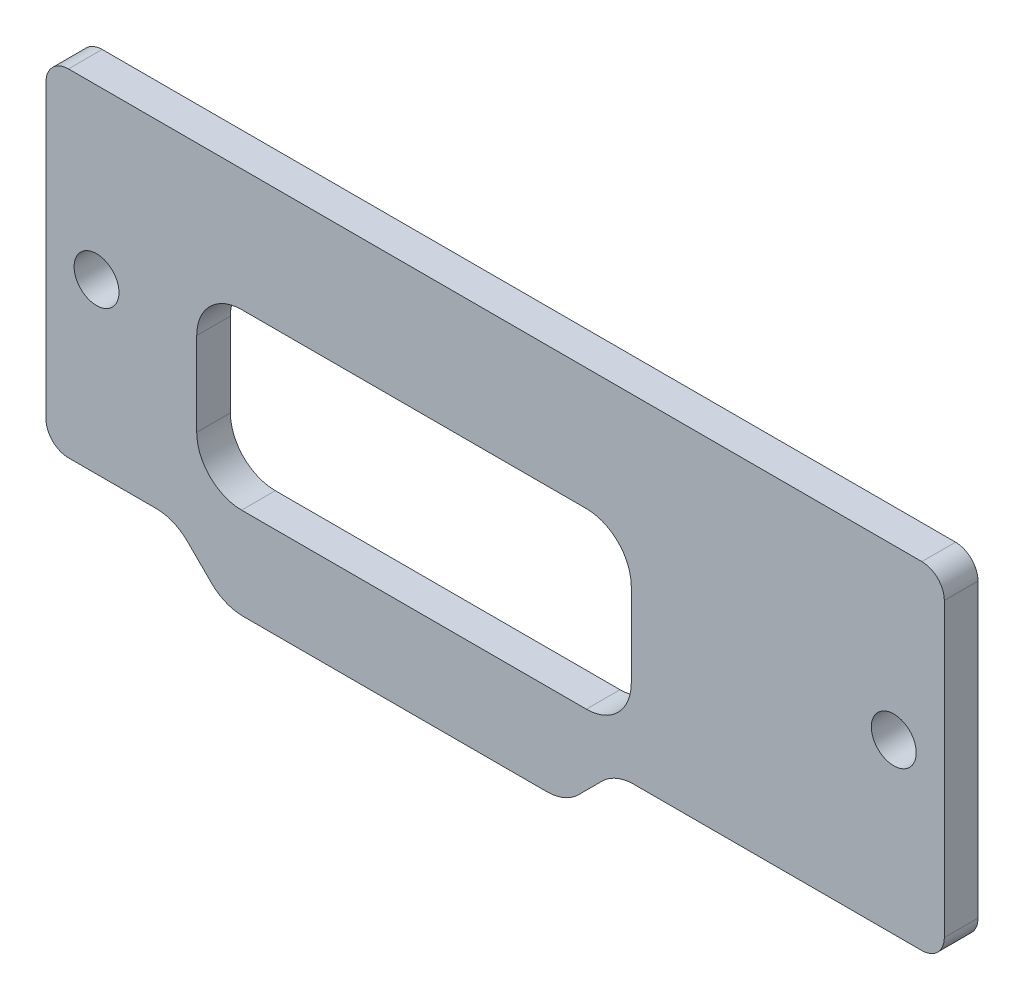
ISO-10303-21;
HEADER;
FILE_DESCRIPTION(('STEP AP214'),'2;1');
FILE_NAME('part.step','',(''),(''),'','','');
FILE_SCHEMA(('AUTOMOTIVE_DESIGN { 1 0 10303 214 1 1 1 1 }'));
ENDSEC;
DATA;
#1=APPLICATION_CONTEXT('core data for automotive mechanical design processes');
#2=APPLICATION_PROTOCOL_DEFINITION('international standard','automotive_design',2000,#1);
#3=PRODUCT_CONTEXT('',#1,'mechanical');
#4=PRODUCT('Part','Part','',(#3));
#5=PRODUCT_RELATED_PRODUCT_CATEGORY('part','',(#4));
#6=PRODUCT_DEFINITION_FORMATION('','',#4);
#7=PRODUCT_DEFINITION_CONTEXT('part definition',#1,'design');
#8=PRODUCT_DEFINITION('design','',#6,#7);
#9=PRODUCT_DEFINITION_SHAPE('','',#8);
#10=(LENGTH_UNIT() NAMED_UNIT(*) SI_UNIT(.MILLI.,.METRE.));
#11=(NAMED_UNIT(*) PLANE_ANGLE_UNIT() SI_UNIT($,.RADIAN.));
#12=(NAMED_UNIT(*) SI_UNIT($,.STERADIAN.) SOLID_ANGLE_UNIT());
#13=UNCERTAINTY_MEASURE_WITH_UNIT(LENGTH_MEASURE(1.E-05),#10,'distance_accuracy_value','');
#14=(GEOMETRIC_REPRESENTATION_CONTEXT(3) GLOBAL_UNCERTAINTY_ASSIGNED_CONTEXT((#13)) GLOBAL_UNIT_ASSIGNED_CONTEXT((#10,
#11,#12)) REPRESENTATION_CONTEXT('',''));
#15=CARTESIAN_POINT('',(0.,0.,0.));
#16=DIRECTION('',(0.,0.,1.));
#17=DIRECTION('',(1.,0.,0.));
#18=AXIS2_PLACEMENT_3D('',#15,#16,#17);
#19=CARTESIAN_POINT('',(-23.9884406525876,-3.16320030945431,1.5));
#20=DIRECTION('',(0.,1.,0.));
#21=DIRECTION('',(-1.,0.,0.));
#22=AXIS2_PLACEMENT_3D('',#19,#20,#21);
#23=PLANE('',#22);
#24=DIRECTION('',(1.,0.,0.));
#25=VECTOR('',#24,1.);
#26=CARTESIAN_POINT('',(-23.9884406525876,-3.16320030945431,1.5));
#27=LINE('',#26,#25);
#28=CARTESIAN_POINT('',(2.18763376843959,-3.1632003094543,1.5));
#29=VERTEX_POINT('',#28);
#30=CARTESIAN_POINT('',(15.0115593474124,-3.1632003094543,1.5));
#31=VERTEX_POINT('',#30);
#32=EDGE_CURVE('E361',#29,#31,#27,.T.);
#33=ORIENTED_EDGE('',*,*,#32,.F.);
#34=DIRECTION('',(0.,0.,-1.));
#35=VECTOR('',#34,1.);
#36=CARTESIAN_POINT('',(2.18763376843959,-3.1632003094543,1.5));
#37=LINE('',#36,#35);
#38=CARTESIAN_POINT('',(2.18763376843959,-3.1632003094543,0.));
#39=VERTEX_POINT('',#38);
#40=EDGE_CURVE('E302',#29,#39,#37,.T.);
#41=ORIENTED_EDGE('',*,*,#40,.T.);
#42=DIRECTION('',(1.,0.,0.));
#43=VECTOR('',#42,1.);
#44=CARTESIAN_POINT('',(-23.9884406525876,-3.16320030945431,0.));
#45=LINE('',#44,#43);
#46=CARTESIAN_POINT('',(15.0115593474124,-3.1632003094543,0.));
#47=VERTEX_POINT('',#46);
#48=EDGE_CURVE('E228',#39,#47,#45,.T.);
#49=ORIENTED_EDGE('',*,*,#48,.T.);
#50=DIRECTION('',(0.,0.,-1.));
#51=VECTOR('',#50,1.);
#52=CARTESIAN_POINT('',(15.0115593474124,-3.1632003094543,1.5));
#53=LINE('',#52,#51);
#54=EDGE_CURVE('E258',#47,#31,#53,.F.);
#55=ORIENTED_EDGE('',*,*,#54,.T.);
#56=EDGE_LOOP('',(#33,#41,#49,#55));
#57=FACE_BOUND('',#56,.T.);
#58=ADVANCED_FACE('F35',(#57),#23,.F.);
#59=CARTESIAN_POINT('',(0.,0.,1.5));
#60=DIRECTION('',(0.,0.,1.));
#61=DIRECTION('',(1.,0.,0.));
#62=AXIS2_PLACEMENT_3D('',#59,#60,#61);
#63=PLANE('',#62);
#64=DIRECTION('',(1.,0.,0.));
#65=VECTOR('',#64,1.);
#66=CARTESIAN_POINT('',(-16.0408149730745,-5.38649190676645,1.5));
#67=LINE('',#66,#65);
#68=CARTESIAN_POINT('',(-15.2123878483284,-5.38649190676645,1.5));
#69=VERTEX_POINT('',#68);
#70=CARTESIAN_POINT('',(-1.69251207836489,-5.3864919067664,1.5));
#71=VERTEX_POINT('',#70);
#72=EDGE_CURVE('E344',#69,#71,#67,.T.);
#73=ORIENTED_EDGE('',*,*,#72,.T.);
#74=CARTESIAN_POINT('',(-1.69251207836489,-3.3864919067664,1.5));
#75=DIRECTION('',(0.,0.,1.));
#76=DIRECTION('',(1.,0.,0.));
#77=AXIS2_PLACEMENT_3D('',#74,#75,#76);
#78=CIRCLE('',#77,2.);
#79=CARTESIAN_POINT('',(-0.278298515991804,-4.8007054691395,1.5));
#80=VERTEX_POINT('',#79);
#81=EDGE_CURVE('E316',#71,#80,#78,.T.);
#82=ORIENTED_EDGE('',*,*,#81,.T.);
#83=DIRECTION('',(0.707106781186549,0.707106781186546,0.));
#84=VECTOR('',#83,1.);
#85=CARTESIAN_POINT('',(-0.864084953618706,-5.3864919067664,1.5));
#86=LINE('',#85,#84);
#87=CARTESIAN_POINT('',(0.773420206066497,-3.74898674708121,1.5));
#88=VERTEX_POINT('',#87);
#89=EDGE_CURVE('E405',#80,#88,#86,.T.);
#90=ORIENTED_EDGE('',*,*,#89,.T.);
#91=CARTESIAN_POINT('',(2.18763376843959,-5.1632003094543,1.5));
#92=DIRECTION('',(0.,0.,1.));
#93=DIRECTION('',(1.,0.,0.));
#94=AXIS2_PLACEMENT_3D('',#91,#92,#93);
#95=CIRCLE('',#94,2.);
#96=EDGE_CURVE('E331',#88,#29,#95,.F.);
#97=ORIENTED_EDGE('',*,*,#96,.T.);
#98=ORIENTED_EDGE('',*,*,#32,.T.);
#99=CARTESIAN_POINT('',(15.0115593474124,-2.1632003094543,1.5));
#100=DIRECTION('',(0.,0.,1.));
#101=DIRECTION('',(1.,0.,0.));
#102=AXIS2_PLACEMENT_3D('',#99,#100,#101);
#103=CIRCLE('',#102,1.);
#104=CARTESIAN_POINT('',(16.0115593474124,-2.1632003094543,1.5));
#105=VERTEX_POINT('',#104);
#106=EDGE_CURVE('E251',#31,#105,#103,.T.);
#107=ORIENTED_EDGE('',*,*,#106,.T.);
#108=DIRECTION('',(0.,1.,0.));
#109=VECTOR('',#108,1.);
#110=CARTESIAN_POINT('',(16.0115593474124,11.8367996905457,1.5));
#111=LINE('',#110,#109);
#112=CARTESIAN_POINT('',(16.0115593474124,10.8367996905457,1.5));
#113=VERTEX_POINT('',#112);
#114=EDGE_CURVE('E236',#105,#113,#111,.T.);
#115=ORIENTED_EDGE('',*,*,#114,.T.);
#116=CARTESIAN_POINT('',(15.0115593474124,10.8367996905457,1.5));
#117=DIRECTION('',(0.,0.,1.));
#118=DIRECTION('',(1.,0.,0.));
#119=AXIS2_PLACEMENT_3D('',#116,#117,#118);
#120=CIRCLE('',#119,1.);
#121=CARTESIAN_POINT('',(15.0115593474124,11.8367996905457,1.5));
#122=VERTEX_POINT('',#121);
#123=EDGE_CURVE('E253',#113,#122,#120,.T.);
#124=ORIENTED_EDGE('',*,*,#123,.T.);
#125=DIRECTION('',(-1.,0.,0.));
#126=VECTOR('',#125,1.);
#127=CARTESIAN_POINT('',(-23.9884406525876,11.8367996905457,1.5));
#128=LINE('',#127,#126);
#129=CARTESIAN_POINT('',(-22.9884406525876,11.8367996905457,1.5));
#130=VERTEX_POINT('',#129);
#131=EDGE_CURVE('E216',#122,#130,#128,.T.);
#132=ORIENTED_EDGE('',*,*,#131,.T.);
#133=CARTESIAN_POINT('',(-22.9884406525876,10.8367996905457,1.5));
#134=DIRECTION('',(0.,0.,1.));
#135=DIRECTION('',(1.,0.,0.));
#136=AXIS2_PLACEMENT_3D('',#133,#134,#135);
#137=CIRCLE('',#136,1.);
#138=CARTESIAN_POINT('',(-23.9884406525876,10.8367996905457,1.5));
#139=VERTEX_POINT('',#138);
#140=EDGE_CURVE('E247',#130,#139,#137,.T.);
#141=ORIENTED_EDGE('',*,*,#140,.T.);
#142=DIRECTION('',(0.,-1.,0.));
#143=VECTOR('',#142,1.);
#144=CARTESIAN_POINT('',(-23.9884406525876,11.8367996905457,1.5));
#145=LINE('',#144,#143);
#146=CARTESIAN_POINT('',(-23.9884406525876,-2.16320030945431,1.5));
#147=VERTEX_POINT('',#146);
#148=EDGE_CURVE('E359',#139,#147,#145,.T.);
#149=ORIENTED_EDGE('',*,*,#148,.T.);
#150=CARTESIAN_POINT('',(-22.9884406525876,-2.16320030945431,1.5));
#151=DIRECTION('',(0.,0.,1.));
#152=DIRECTION('',(1.,0.,0.));
#153=AXIS2_PLACEMENT_3D('',#150,#151,#152);
#154=CIRCLE('',#153,1.);
#155=CARTESIAN_POINT('',(-22.9884406525876,-3.16320030945431,1.5));
#156=VERTEX_POINT('',#155);
#157=EDGE_CURVE('E249',#147,#156,#154,.T.);
#158=ORIENTED_EDGE('',*,*,#157,.T.);
#159=CARTESIAN_POINT('',(-19.0925336951329,-3.16320030945431,1.5));
#160=VERTEX_POINT('',#159);
#161=EDGE_CURVE('E237',#156,#160,#27,.T.);
#162=ORIENTED_EDGE('',*,*,#161,.T.);
#163=CARTESIAN_POINT('',(-19.0925336951329,-5.16320030945431,1.5));
#164=DIRECTION('',(0.,0.,1.));
#165=DIRECTION('',(1.,0.,0.));
#166=AXIS2_PLACEMENT_3D('',#163,#164,#165);
#167=CIRCLE('',#166,2.);
#168=CARTESIAN_POINT('',(-17.6783201327598,-3.74898674708119,1.5));
#169=VERTEX_POINT('',#168);
#170=EDGE_CURVE('E43',#160,#169,#167,.F.);
#171=ORIENTED_EDGE('',*,*,#170,.T.);
#172=DIRECTION('',(0.707106781186556,-0.707106781186539,0.));
#173=VECTOR('',#172,1.);
#174=CARTESIAN_POINT('',(-18.8396405091301,-2.587666370711,1.5));
#175=LINE('',#174,#173);
#176=CARTESIAN_POINT('',(-16.6266014107015,-4.80070546913956,1.5));
#177=VERTEX_POINT('',#176);
#178=EDGE_CURVE('E338',#169,#177,#175,.T.);
#179=ORIENTED_EDGE('',*,*,#178,.T.);
#180=CARTESIAN_POINT('',(-15.2123878483284,-3.38649190676645,1.5));
#181=DIRECTION('',(0.,0.,1.));
#182=DIRECTION('',(1.,0.,0.));
#183=AXIS2_PLACEMENT_3D('',#180,#181,#182);
#184=CIRCLE('',#183,2.);
#185=EDGE_CURVE('E314',#177,#69,#184,.T.);
#186=ORIENTED_EDGE('',*,*,#185,.T.);
#187=EDGE_LOOP('',(#73,#82,#90,#97,#98,#107,#115,#124,#132,#141,#149,#158,#162,#171,#179,#186));
#188=FACE_BOUND('',#187,.T.);
#189=DIRECTION('',(0.,1.,0.));
#190=VECTOR('',#189,1.);
#191=CARTESIAN_POINT('',(2.07197520372589,6.40966960987009,1.5));
#192=LINE('',#191,#190);
#193=CARTESIAN_POINT('',(2.07197520372589,0.676475828944844,1.5));
#194=VERTEX_POINT('',#193);
#195=CARTESIAN_POINT('',(2.07197520372589,4.40966960987009,1.5));
#196=VERTEX_POINT('',#195);
#197=EDGE_CURVE('E389',#194,#196,#192,.T.);
#198=ORIENTED_EDGE('',*,*,#197,.F.);
#199=CARTESIAN_POINT('',(0.071975203725887,0.676475828944844,1.5));
#200=DIRECTION('',(0.,0.,1.));
#201=DIRECTION('',(1.,0.,0.));
#202=AXIS2_PLACEMENT_3D('',#199,#200,#201);
#203=CIRCLE('',#202,2.);
#204=CARTESIAN_POINT('',(0.0719752037258853,-1.32352417105516,1.5));
#205=VERTEX_POINT('',#204);
#206=EDGE_CURVE('E290',#194,#205,#203,.F.);
#207=ORIENTED_EDGE('',*,*,#206,.T.);
#208=DIRECTION('',(1.,0.,0.));
#209=VECTOR('',#208,1.);
#210=CARTESIAN_POINT('',(-17.2774271650427,-1.32352417105516,1.5));
#211=LINE('',#210,#209);
#212=CARTESIAN_POINT('',(-15.2774271650427,-1.32352417105516,1.5));
#213=VERTEX_POINT('',#212);
#214=EDGE_CURVE('E379',#213,#205,#211,.T.);
#215=ORIENTED_EDGE('',*,*,#214,.F.);
#216=CARTESIAN_POINT('',(-15.2774271650427,0.676475828944844,1.5));
#217=DIRECTION('',(0.,0.,1.));
#218=DIRECTION('',(1.,0.,0.));
#219=AXIS2_PLACEMENT_3D('',#216,#217,#218);
#220=CIRCLE('',#219,2.);
#221=CARTESIAN_POINT('',(-17.2774271650427,0.676475828944844,1.5));
#222=VERTEX_POINT('',#221);
#223=EDGE_CURVE('E294',#213,#222,#220,.F.);
#224=ORIENTED_EDGE('',*,*,#223,.T.);
#225=DIRECTION('',(0.,-1.,0.));
#226=VECTOR('',#225,1.);
#227=CARTESIAN_POINT('',(-17.2774271650427,6.40966960987009,1.5));
#228=LINE('',#227,#226);
#229=CARTESIAN_POINT('',(-17.2774271650427,4.40966960987009,1.5));
#230=VERTEX_POINT('',#229);
#231=EDGE_CURVE('E383',#230,#222,#228,.T.);
#232=ORIENTED_EDGE('',*,*,#231,.F.);
#233=CARTESIAN_POINT('',(-15.2774271650427,4.40966960987009,1.5));
#234=DIRECTION('',(0.,0.,1.));
#235=DIRECTION('',(1.,0.,0.));
#236=AXIS2_PLACEMENT_3D('',#233,#234,#235);
#237=CIRCLE('',#236,2.);
#238=CARTESIAN_POINT('',(-15.2774271650427,6.40966960987009,1.5));
#239=VERTEX_POINT('',#238);
#240=EDGE_CURVE('E298',#230,#239,#237,.F.);
#241=ORIENTED_EDGE('',*,*,#240,.T.);
#242=DIRECTION('',(-1.,0.,0.));
#243=VECTOR('',#242,1.);
#244=CARTESIAN_POINT('',(-17.2774271650427,6.40966960987009,1.5));
#245=LINE('',#244,#243);
#246=CARTESIAN_POINT('',(0.0719752037258853,6.40966960987009,1.5));
#247=VERTEX_POINT('',#246);
#248=EDGE_CURVE('E386',#247,#239,#245,.T.);
#249=ORIENTED_EDGE('',*,*,#248,.F.);
#250=CARTESIAN_POINT('',(0.0719752037258853,4.40966960987009,1.5));
#251=DIRECTION('',(0.,0.,1.));
#252=DIRECTION('',(1.,0.,0.));
#253=AXIS2_PLACEMENT_3D('',#250,#251,#252);
#254=CIRCLE('',#253,2.);
#255=EDGE_CURVE('E286',#247,#196,#254,.F.);
#256=ORIENTED_EDGE('',*,*,#255,.T.);
#257=EDGE_LOOP('',(#198,#207,#215,#224,#232,#241,#249,#256));
#258=FACE_BOUND('',#257,.T.);
#259=CARTESIAN_POINT('',(-21.7384406525876,4.33679969054569,1.5));
#260=DIRECTION('',(0.,0.,1.));
#261=DIRECTION('',(1.,0.,0.));
#262=AXIS2_PLACEMENT_3D('',#259,#260,#261);
#263=CIRCLE('',#262,1.);
#264=CARTESIAN_POINT('',(-20.7384406525876,4.33679969054569,1.5));
#265=VERTEX_POINT('',#264);
#266=EDGE_CURVE('E230',#265,#265,#263,.T.);
#267=ORIENTED_EDGE('',*,*,#266,.F.);
#268=EDGE_LOOP('',(#267));
#269=FACE_BOUND('',#268,.T.);
#270=CARTESIAN_POINT('',(13.7615593474124,4.3367996905457,1.5));
#271=DIRECTION('',(0.,0.,1.));
#272=DIRECTION('',(1.,0.,0.));
#273=AXIS2_PLACEMENT_3D('',#270,#271,#272);
#274=CIRCLE('',#273,1.);
#275=CARTESIAN_POINT('',(14.7615593474124,4.3367996905457,1.5));
#276=VERTEX_POINT('',#275);
#277=EDGE_CURVE('E370',#276,#276,#274,.T.);
#278=ORIENTED_EDGE('',*,*,#277,.F.);
#279=EDGE_LOOP('',(#278));
#280=FACE_BOUND('',#279,.T.);
#281=ADVANCED_FACE('F336',(#188,#258,#269,#280),#63,.T.);
#282=CARTESIAN_POINT('',(0.,0.,0.));
#283=DIRECTION('',(0.,0.,1.));
#284=DIRECTION('',(1.,0.,0.));
#285=AXIS2_PLACEMENT_3D('',#282,#283,#284);
#286=PLANE('',#285);
#287=DIRECTION('',(0.,-1.,0.));
#288=VECTOR('',#287,1.);
#289=CARTESIAN_POINT('',(-17.2774271650427,6.40966960987009,0.));
#290=LINE('',#289,#288);
#291=CARTESIAN_POINT('',(-17.2774271650427,4.40966960987009,0.));
#292=VERTEX_POINT('',#291);
#293=CARTESIAN_POINT('',(-17.2774271650427,0.676475828944844,0.));
#294=VERTEX_POINT('',#293);
#295=EDGE_CURVE('E395',#292,#294,#290,.T.);
#296=ORIENTED_EDGE('',*,*,#295,.T.);
#297=CARTESIAN_POINT('',(-15.2774271650427,0.676475828944844,0.));
#298=DIRECTION('',(0.,0.,1.));
#299=DIRECTION('',(1.,0.,0.));
#300=AXIS2_PLACEMENT_3D('',#297,#298,#299);
#301=CIRCLE('',#300,2.);
#302=CARTESIAN_POINT('',(-15.2774271650427,-1.32352417105516,0.));
#303=VERTEX_POINT('',#302);
#304=EDGE_CURVE('E296',#294,#303,#301,.T.);
#305=ORIENTED_EDGE('',*,*,#304,.T.);
#306=DIRECTION('',(1.,0.,0.));
#307=VECTOR('',#306,1.);
#308=CARTESIAN_POINT('',(-17.2774271650427,-1.32352417105516,0.));
#309=LINE('',#308,#307);
#310=CARTESIAN_POINT('',(0.0719752037258853,-1.32352417105516,0.));
#311=VERTEX_POINT('',#310);
#312=EDGE_CURVE('E376',#303,#311,#309,.T.);
#313=ORIENTED_EDGE('',*,*,#312,.T.);
#314=CARTESIAN_POINT('',(0.071975203725887,0.676475828944844,0.));
#315=DIRECTION('',(0.,0.,1.));
#316=DIRECTION('',(1.,0.,0.));
#317=AXIS2_PLACEMENT_3D('',#314,#315,#316);
#318=CIRCLE('',#317,2.);
#319=CARTESIAN_POINT('',(2.07197520372589,0.676475828944844,0.));
#320=VERTEX_POINT('',#319);
#321=EDGE_CURVE('E292',#311,#320,#318,.T.);
#322=ORIENTED_EDGE('',*,*,#321,.T.);
#323=DIRECTION('',(0.,1.,0.));
#324=VECTOR('',#323,1.);
#325=CARTESIAN_POINT('',(2.07197520372589,6.40966960987009,0.));
#326=LINE('',#325,#324);
#327=CARTESIAN_POINT('',(2.07197520372589,4.40966960987009,0.));
#328=VERTEX_POINT('',#327);
#329=EDGE_CURVE('E382',#320,#328,#326,.T.);
#330=ORIENTED_EDGE('',*,*,#329,.T.);
#331=CARTESIAN_POINT('',(0.0719752037258853,4.40966960987009,0.));
#332=DIRECTION('',(0.,0.,1.));
#333=DIRECTION('',(1.,0.,0.));
#334=AXIS2_PLACEMENT_3D('',#331,#332,#333);
#335=CIRCLE('',#334,2.);
#336=CARTESIAN_POINT('',(0.0719752037258853,6.40966960987009,0.));
#337=VERTEX_POINT('',#336);
#338=EDGE_CURVE('E288',#328,#337,#335,.T.);
#339=ORIENTED_EDGE('',*,*,#338,.T.);
#340=DIRECTION('',(-1.,0.,0.));
#341=VECTOR('',#340,1.);
#342=CARTESIAN_POINT('',(-17.2774271650427,6.40966960987009,0.));
#343=LINE('',#342,#341);
#344=CARTESIAN_POINT('',(-15.2774271650427,6.40966960987009,0.));
#345=VERTEX_POINT('',#344);
#346=EDGE_CURVE('E398',#337,#345,#343,.T.);
#347=ORIENTED_EDGE('',*,*,#346,.T.);
#348=CARTESIAN_POINT('',(-15.2774271650427,4.40966960987009,0.));
#349=DIRECTION('',(0.,0.,1.));
#350=DIRECTION('',(1.,0.,0.));
#351=AXIS2_PLACEMENT_3D('',#348,#349,#350);
#352=CIRCLE('',#351,2.);
#353=EDGE_CURVE('E300',#345,#292,#352,.T.);
#354=ORIENTED_EDGE('',*,*,#353,.T.);
#355=EDGE_LOOP('',(#296,#305,#313,#322,#330,#339,#347,#354));
#356=FACE_BOUND('',#355,.T.);
#357=DIRECTION('',(-0.707106781186549,-0.707106781186546,0.));
#358=VECTOR('',#357,1.);
#359=CARTESIAN_POINT('',(-0.864084953618706,-5.3864919067664,0.));
#360=LINE('',#359,#358);
#361=CARTESIAN_POINT('',(0.773420206066498,-3.74898674708121,0.));
#362=VERTEX_POINT('',#361);
#363=CARTESIAN_POINT('',(-0.278298515991804,-4.8007054691395,0.));
#364=VERTEX_POINT('',#363);
#365=EDGE_CURVE('E404',#362,#364,#360,.T.);
#366=ORIENTED_EDGE('',*,*,#365,.T.);
#367=CARTESIAN_POINT('',(-1.69251207836489,-3.3864919067664,0.));
#368=DIRECTION('',(0.,0.,1.));
#369=DIRECTION('',(1.,0.,0.));
#370=AXIS2_PLACEMENT_3D('',#367,#368,#369);
#371=CIRCLE('',#370,2.);
#372=CARTESIAN_POINT('',(-1.69251207836489,-5.3864919067664,0.));
#373=VERTEX_POINT('',#372);
#374=EDGE_CURVE('E320',#364,#373,#371,.F.);
#375=ORIENTED_EDGE('',*,*,#374,.T.);
#376=DIRECTION('',(-1.,0.,0.));
#377=VECTOR('',#376,1.);
#378=CARTESIAN_POINT('',(-16.0408149730745,-5.38649190676645,0.));
#379=LINE('',#378,#377);
#380=CARTESIAN_POINT('',(-15.2123878483284,-5.38649190676645,0.));
#381=VERTEX_POINT('',#380);
#382=EDGE_CURVE('E408',#373,#381,#379,.T.);
#383=ORIENTED_EDGE('',*,*,#382,.T.);
#384=CARTESIAN_POINT('',(-15.2123878483284,-3.38649190676645,0.));
#385=DIRECTION('',(0.,0.,1.));
#386=DIRECTION('',(1.,0.,0.));
#387=AXIS2_PLACEMENT_3D('',#384,#385,#386);
#388=CIRCLE('',#387,2.);
#389=CARTESIAN_POINT('',(-16.6266014107015,-4.80070546913956,0.));
#390=VERTEX_POINT('',#389);
#391=EDGE_CURVE('E318',#381,#390,#388,.F.);
#392=ORIENTED_EDGE('',*,*,#391,.T.);
#393=DIRECTION('',(-0.707106781186556,0.707106781186539,0.));
#394=VECTOR('',#393,1.);
#395=CARTESIAN_POINT('',(-18.8396405091301,-2.587666370711,0.));
#396=LINE('',#395,#394);
#397=CARTESIAN_POINT('',(-17.6783201327598,-3.74898674708119,0.));
#398=VERTEX_POINT('',#397);
#399=EDGE_CURVE('E392',#390,#398,#396,.T.);
#400=ORIENTED_EDGE('',*,*,#399,.T.);
#401=CARTESIAN_POINT('',(-19.0925336951329,-5.16320030945431,0.));
#402=DIRECTION('',(0.,0.,1.));
#403=DIRECTION('',(1.,0.,0.));
#404=AXIS2_PLACEMENT_3D('',#401,#402,#403);
#405=CIRCLE('',#404,2.);
#406=CARTESIAN_POINT('',(-19.0925336951329,-3.16320030945431,0.));
#407=VERTEX_POINT('',#406);
#408=EDGE_CURVE('E11',#398,#407,#405,.T.);
#409=ORIENTED_EDGE('',*,*,#408,.T.);
#410=CARTESIAN_POINT('',(-22.9884406525876,-3.16320030945431,0.));
#411=VERTEX_POINT('',#410);
#412=EDGE_CURVE('E234',#411,#407,#45,.T.);
#413=ORIENTED_EDGE('',*,*,#412,.F.);
#414=CARTESIAN_POINT('',(-22.9884406525876,-2.16320030945431,0.));
#415=DIRECTION('',(0.,0.,1.));
#416=DIRECTION('',(1.,0.,0.));
#417=AXIS2_PLACEMENT_3D('',#414,#415,#416);
#418=CIRCLE('',#417,1.);
#419=CARTESIAN_POINT('',(-23.9884406525876,-2.16320030945431,0.));
#420=VERTEX_POINT('',#419);
#421=EDGE_CURVE('E240',#411,#420,#418,.F.);
#422=ORIENTED_EDGE('',*,*,#421,.T.);
#423=DIRECTION('',(0.,-1.,0.));
#424=VECTOR('',#423,1.);
#425=CARTESIAN_POINT('',(-23.9884406525876,11.8367996905457,0.));
#426=LINE('',#425,#424);
#427=CARTESIAN_POINT('',(-23.9884406525876,10.8367996905457,0.));
#428=VERTEX_POINT('',#427);
#429=EDGE_CURVE('E224',#428,#420,#426,.T.);
#430=ORIENTED_EDGE('',*,*,#429,.F.);
#431=CARTESIAN_POINT('',(-22.9884406525876,10.8367996905457,0.));
#432=DIRECTION('',(0.,0.,1.));
#433=DIRECTION('',(1.,0.,0.));
#434=AXIS2_PLACEMENT_3D('',#431,#432,#433);
#435=CIRCLE('',#434,1.);
#436=CARTESIAN_POINT('',(-22.9884406525876,11.8367996905457,0.));
#437=VERTEX_POINT('',#436);
#438=EDGE_CURVE('E217',#428,#437,#435,.F.);
#439=ORIENTED_EDGE('',*,*,#438,.T.);
#440=DIRECTION('',(-1.,0.,0.));
#441=VECTOR('',#440,1.);
#442=CARTESIAN_POINT('',(-23.9884406525876,11.8367996905457,0.));
#443=LINE('',#442,#441);
#444=CARTESIAN_POINT('',(15.0115593474124,11.8367996905457,0.));
#445=VERTEX_POINT('',#444);
#446=EDGE_CURVE('E213',#445,#437,#443,.T.);
#447=ORIENTED_EDGE('',*,*,#446,.F.);
#448=CARTESIAN_POINT('',(15.0115593474124,10.8367996905457,0.));
#449=DIRECTION('',(0.,0.,1.));
#450=DIRECTION('',(1.,0.,0.));
#451=AXIS2_PLACEMENT_3D('',#448,#449,#450);
#452=CIRCLE('',#451,1.);
#453=CARTESIAN_POINT('',(16.0115593474124,10.8367996905457,0.));
#454=VERTEX_POINT('',#453);
#455=EDGE_CURVE('E197',#445,#454,#452,.F.);
#456=ORIENTED_EDGE('',*,*,#455,.T.);
#457=DIRECTION('',(0.,1.,0.));
#458=VECTOR('',#457,1.);
#459=CARTESIAN_POINT('',(16.0115593474124,11.8367996905457,0.));
#460=LINE('',#459,#458);
#461=CARTESIAN_POINT('',(16.0115593474124,-2.1632003094543,0.));
#462=VERTEX_POINT('',#461);
#463=EDGE_CURVE('E225',#462,#454,#460,.T.);
#464=ORIENTED_EDGE('',*,*,#463,.F.);
#465=CARTESIAN_POINT('',(15.0115593474124,-2.1632003094543,0.));
#466=DIRECTION('',(0.,0.,1.));
#467=DIRECTION('',(1.,0.,0.));
#468=AXIS2_PLACEMENT_3D('',#465,#466,#467);
#469=CIRCLE('',#468,1.);
#470=EDGE_CURVE('E207',#462,#47,#469,.F.);
#471=ORIENTED_EDGE('',*,*,#470,.T.);
#472=ORIENTED_EDGE('',*,*,#48,.F.);
#473=CARTESIAN_POINT('',(2.18763376843959,-5.1632003094543,0.));
#474=DIRECTION('',(0.,0.,1.));
#475=DIRECTION('',(1.,0.,0.));
#476=AXIS2_PLACEMENT_3D('',#473,#474,#475);
#477=CIRCLE('',#476,2.);
#478=EDGE_CURVE('E329',#39,#362,#477,.T.);
#479=ORIENTED_EDGE('',*,*,#478,.T.);
#480=EDGE_LOOP('',(#366,#375,#383,#392,#400,#409,#413,#422,#430,#439,#447,#456,#464,#471,#472,#479));
#481=FACE_BOUND('',#480,.T.);
#482=CARTESIAN_POINT('',(-21.7384406525876,4.33679969054569,0.));
#483=DIRECTION('',(0.,0.,1.));
#484=DIRECTION('',(1.,0.,0.));
#485=AXIS2_PLACEMENT_3D('',#482,#483,#484);
#486=CIRCLE('',#485,1.);
#487=CARTESIAN_POINT('',(-20.7384406525876,4.33679969054569,0.));
#488=VERTEX_POINT('',#487);
#489=EDGE_CURVE('E367',#488,#488,#486,.T.);
#490=ORIENTED_EDGE('',*,*,#489,.T.);
#491=EDGE_LOOP('',(#490));
#492=FACE_BOUND('',#491,.T.);
#493=CARTESIAN_POINT('',(13.7615593474124,4.3367996905457,0.));
#494=DIRECTION('',(0.,0.,1.));
#495=DIRECTION('',(1.,0.,0.));
#496=AXIS2_PLACEMENT_3D('',#493,#494,#495);
#497=CIRCLE('',#496,1.);
#498=CARTESIAN_POINT('',(14.7615593474124,4.3367996905457,0.));
#499=VERTEX_POINT('',#498);
#500=EDGE_CURVE('E373',#499,#499,#497,.T.);
#501=ORIENTED_EDGE('',*,*,#500,.T.);
#502=EDGE_LOOP('',(#501));
#503=FACE_BOUND('',#502,.T.);
#504=ADVANCED_FACE('F221',(#356,#481,#492,#503),#286,.F.);
#505=CARTESIAN_POINT('',(16.0115593474124,11.8367996905457,1.5));
#506=DIRECTION('',(-1.,0.,0.));
#507=DIRECTION('',(0.,-1.,0.));
#508=AXIS2_PLACEMENT_3D('',#505,#506,#507);
#509=PLANE('',#508);
#510=ORIENTED_EDGE('',*,*,#463,.T.);
#511=DIRECTION('',(0.,0.,-1.));
#512=VECTOR('',#511,1.);
#513=CARTESIAN_POINT('',(16.0115593474124,10.8367996905457,1.5));
#514=LINE('',#513,#512);
#515=EDGE_CURVE('E202',#454,#113,#514,.F.);
#516=ORIENTED_EDGE('',*,*,#515,.T.);
#517=ORIENTED_EDGE('',*,*,#114,.F.);
#518=DIRECTION('',(0.,0.,-1.));
#519=VECTOR('',#518,1.);
#520=CARTESIAN_POINT('',(16.0115593474124,-2.1632003094543,1.5));
#521=LINE('',#520,#519);
#522=EDGE_CURVE('E206',#105,#462,#521,.T.);
#523=ORIENTED_EDGE('',*,*,#522,.T.);
#524=EDGE_LOOP('',(#510,#516,#517,#523));
#525=FACE_BOUND('',#524,.T.);
#526=ADVANCED_FACE('F443',(#525),#509,.F.);
#527=CARTESIAN_POINT('',(-23.9884406525876,11.8367996905457,1.5));
#528=DIRECTION('',(0.,-1.,0.));
#529=DIRECTION('',(1.,0.,0.));
#530=AXIS2_PLACEMENT_3D('',#527,#528,#529);
#531=PLANE('',#530);
#532=ORIENTED_EDGE('',*,*,#131,.F.);
#533=DIRECTION('',(0.,0.,-1.));
#534=VECTOR('',#533,1.);
#535=CARTESIAN_POINT('',(15.0115593474124,11.8367996905457,1.5));
#536=LINE('',#535,#534);
#537=EDGE_CURVE('E201',#122,#445,#536,.T.);
#538=ORIENTED_EDGE('',*,*,#537,.T.);
#539=ORIENTED_EDGE('',*,*,#446,.T.);
#540=DIRECTION('',(0.,0.,-1.));
#541=VECTOR('',#540,1.);
#542=CARTESIAN_POINT('',(-22.9884406525876,11.8367996905457,1.5));
#543=LINE('',#542,#541);
#544=EDGE_CURVE('E218',#437,#130,#543,.F.);
#545=ORIENTED_EDGE('',*,*,#544,.T.);
#546=EDGE_LOOP('',(#532,#538,#539,#545));
#547=FACE_BOUND('',#546,.T.);
#548=ADVANCED_FACE('F212',(#547),#531,.F.);
#549=CARTESIAN_POINT('',(-23.9884406525876,11.8367996905457,1.5));
#550=DIRECTION('',(1.,0.,0.));
#551=DIRECTION('',(0.,1.,0.));
#552=AXIS2_PLACEMENT_3D('',#549,#550,#551);
#553=PLANE('',#552);
#554=ORIENTED_EDGE('',*,*,#429,.T.);
#555=DIRECTION('',(0.,0.,-1.));
#556=VECTOR('',#555,1.);
#557=CARTESIAN_POINT('',(-23.9884406525876,-2.16320030945431,1.5));
#558=LINE('',#557,#556);
#559=EDGE_CURVE('E264',#420,#147,#558,.F.);
#560=ORIENTED_EDGE('',*,*,#559,.T.);
#561=ORIENTED_EDGE('',*,*,#148,.F.);
#562=DIRECTION('',(0.,0.,-1.));
#563=VECTOR('',#562,1.);
#564=CARTESIAN_POINT('',(-23.9884406525876,10.8367996905457,1.5));
#565=LINE('',#564,#563);
#566=EDGE_CURVE('E261',#139,#428,#565,.T.);
#567=ORIENTED_EDGE('',*,*,#566,.T.);
#568=EDGE_LOOP('',(#554,#560,#561,#567));
#569=FACE_BOUND('',#568,.T.);
#570=ADVANCED_FACE('F353',(#569),#553,.F.);
#571=ORIENTED_EDGE('',*,*,#412,.T.);
#572=DIRECTION('',(0.,0.,1.));
#573=VECTOR('',#572,1.);
#574=CARTESIAN_POINT('',(-19.0925336951329,-3.16320030945431,1.5));
#575=LINE('',#574,#573);
#576=EDGE_CURVE('E322',#407,#160,#575,.T.);
#577=ORIENTED_EDGE('',*,*,#576,.T.);
#578=ORIENTED_EDGE('',*,*,#161,.F.);
#579=DIRECTION('',(0.,0.,-1.));
#580=VECTOR('',#579,1.);
#581=CARTESIAN_POINT('',(-22.9884406525876,-3.16320030945431,1.5));
#582=LINE('',#581,#580);
#583=EDGE_CURVE('E255',#156,#411,#582,.T.);
#584=ORIENTED_EDGE('',*,*,#583,.T.);
#585=EDGE_LOOP('',(#571,#577,#578,#584));
#586=FACE_BOUND('',#585,.T.);
#587=ADVANCED_FACE('F348',(#586),#23,.F.);
#588=CARTESIAN_POINT('',(-21.7384406525876,4.33679969054569,1.5));
#589=DIRECTION('',(0.,0.,-1.));
#590=DIRECTION('',(-1.,0.,0.));
#591=AXIS2_PLACEMENT_3D('',#588,#589,#590);
#592=CYLINDRICAL_SURFACE('',#591,1.);
#593=ORIENTED_EDGE('',*,*,#266,.T.);
#594=EDGE_LOOP('',(#593));
#595=FACE_BOUND('',#594,.T.);
#596=ORIENTED_EDGE('',*,*,#489,.F.);
#597=EDGE_LOOP('',(#596));
#598=FACE_BOUND('',#597,.T.);
#599=ADVANCED_FACE('F462',(#595,#598),#592,.F.);
#600=CARTESIAN_POINT('',(13.7615593474124,4.3367996905457,1.5));
#601=DIRECTION('',(0.,0.,-1.));
#602=DIRECTION('',(-1.,0.,0.));
#603=AXIS2_PLACEMENT_3D('',#600,#601,#602);
#604=CYLINDRICAL_SURFACE('',#603,1.);
#605=ORIENTED_EDGE('',*,*,#277,.T.);
#606=EDGE_LOOP('',(#605));
#607=FACE_BOUND('',#606,.T.);
#608=ORIENTED_EDGE('',*,*,#500,.F.);
#609=EDGE_LOOP('',(#608));
#610=FACE_BOUND('',#609,.T.);
#611=ADVANCED_FACE('F467',(#607,#610),#604,.F.);
#612=CARTESIAN_POINT('',(2.07197520372589,6.40966960987009,0.));
#613=DIRECTION('',(1.,0.,0.));
#614=DIRECTION('',(0.,0.,-1.));
#615=AXIS2_PLACEMENT_3D('',#612,#613,#614);
#616=PLANE('',#615);
#617=ORIENTED_EDGE('',*,*,#197,.T.);
#618=DIRECTION('',(0.,0.,1.));
#619=VECTOR('',#618,1.);
#620=CARTESIAN_POINT('',(2.07197520372589,4.40966960987009,0.));
#621=LINE('',#620,#619);
#622=EDGE_CURVE('E274',#196,#328,#621,.F.);
#623=ORIENTED_EDGE('',*,*,#622,.T.);
#624=ORIENTED_EDGE('',*,*,#329,.F.);
#625=DIRECTION('',(0.,0.,1.));
#626=VECTOR('',#625,1.);
#627=CARTESIAN_POINT('',(2.07197520372589,0.676475828944844,1.5));
#628=LINE('',#627,#626);
#629=EDGE_CURVE('E271',#320,#194,#628,.T.);
#630=ORIENTED_EDGE('',*,*,#629,.T.);
#631=EDGE_LOOP('',(#617,#623,#624,#630));
#632=FACE_BOUND('',#631,.T.);
#633=ADVANCED_FACE('F491',(#632),#616,.F.);
#634=CARTESIAN_POINT('',(-17.2774271650427,-1.32352417105516,0.));
#635=DIRECTION('',(0.,-1.,0.));
#636=DIRECTION('',(0.,0.,-1.));
#637=AXIS2_PLACEMENT_3D('',#634,#635,#636);
#638=PLANE('',#637);
#639=ORIENTED_EDGE('',*,*,#214,.T.);
#640=DIRECTION('',(0.,0.,1.));
#641=VECTOR('',#640,1.);
#642=CARTESIAN_POINT('',(0.071975203725887,-1.32352417105516,0.));
#643=LINE('',#642,#641);
#644=EDGE_CURVE('E279',#205,#311,#643,.F.);
#645=ORIENTED_EDGE('',*,*,#644,.T.);
#646=ORIENTED_EDGE('',*,*,#312,.F.);
#647=DIRECTION('',(0.,0.,1.));
#648=VECTOR('',#647,1.);
#649=CARTESIAN_POINT('',(-15.2774271650427,-1.32352417105516,1.5));
#650=LINE('',#649,#648);
#651=EDGE_CURVE('E276',#303,#213,#650,.T.);
#652=ORIENTED_EDGE('',*,*,#651,.T.);
#653=EDGE_LOOP('',(#639,#645,#646,#652));
#654=FACE_BOUND('',#653,.T.);
#655=ADVANCED_FACE('F602',(#654),#638,.F.);
#656=CARTESIAN_POINT('',(-17.2774271650427,6.40966960987009,0.));
#657=DIRECTION('',(-1.,0.,0.));
#658=DIRECTION('',(0.,0.,1.));
#659=AXIS2_PLACEMENT_3D('',#656,#657,#658);
#660=PLANE('',#659);
#661=ORIENTED_EDGE('',*,*,#231,.T.);
#662=DIRECTION('',(0.,0.,1.));
#663=VECTOR('',#662,1.);
#664=CARTESIAN_POINT('',(-17.2774271650427,0.676475828944844,0.));
#665=LINE('',#664,#663);
#666=EDGE_CURVE('E284',#222,#294,#665,.F.);
#667=ORIENTED_EDGE('',*,*,#666,.T.);
#668=ORIENTED_EDGE('',*,*,#295,.F.);
#669=DIRECTION('',(0.,0.,1.));
#670=VECTOR('',#669,1.);
#671=CARTESIAN_POINT('',(-17.2774271650427,4.40966960987009,1.5));
#672=LINE('',#671,#670);
#673=EDGE_CURVE('E281',#292,#230,#672,.T.);
#674=ORIENTED_EDGE('',*,*,#673,.T.);
#675=EDGE_LOOP('',(#661,#667,#668,#674));
#676=FACE_BOUND('',#675,.T.);
#677=ADVANCED_FACE('F596',(#676),#660,.F.);
#678=CARTESIAN_POINT('',(-17.2774271650427,6.40966960987009,0.));
#679=DIRECTION('',(0.,1.,0.));
#680=DIRECTION('',(0.,0.,1.));
#681=AXIS2_PLACEMENT_3D('',#678,#679,#680);
#682=PLANE('',#681);
#683=ORIENTED_EDGE('',*,*,#346,.F.);
#684=DIRECTION('',(0.,0.,1.));
#685=VECTOR('',#684,1.);
#686=CARTESIAN_POINT('',(0.0719752037258853,6.40966960987009,1.5));
#687=LINE('',#686,#685);
#688=EDGE_CURVE('E268',#337,#247,#687,.T.);
#689=ORIENTED_EDGE('',*,*,#688,.T.);
#690=ORIENTED_EDGE('',*,*,#248,.T.);
#691=DIRECTION('',(0.,0.,1.));
#692=VECTOR('',#691,1.);
#693=CARTESIAN_POINT('',(-15.2774271650427,6.40966960987009,0.));
#694=LINE('',#693,#692);
#695=EDGE_CURVE('E266',#239,#345,#694,.F.);
#696=ORIENTED_EDGE('',*,*,#695,.T.);
#697=EDGE_LOOP('',(#683,#689,#690,#696));
#698=FACE_BOUND('',#697,.T.);
#699=ADVANCED_FACE('F593',(#698),#682,.F.);
#700=CARTESIAN_POINT('',(15.0115593474124,10.8367996905457,1.5));
#701=DIRECTION('',(0.,0.,-1.));
#702=DIRECTION('',(-1.,0.,0.));
#703=AXIS2_PLACEMENT_3D('',#700,#701,#702);
#704=CYLINDRICAL_SURFACE('',#703,1.);
#705=ORIENTED_EDGE('',*,*,#123,.F.);
#706=ORIENTED_EDGE('',*,*,#515,.F.);
#707=ORIENTED_EDGE('',*,*,#455,.F.);
#708=ORIENTED_EDGE('',*,*,#537,.F.);
#709=EDGE_LOOP('',(#705,#706,#707,#708));
#710=FACE_BOUND('',#709,.T.);
#711=ADVANCED_FACE('F200',(#710),#704,.T.);
#712=CARTESIAN_POINT('',(15.0115593474124,-2.1632003094543,1.5));
#713=DIRECTION('',(0.,0.,-1.));
#714=DIRECTION('',(-1.,0.,0.));
#715=AXIS2_PLACEMENT_3D('',#712,#713,#714);
#716=CYLINDRICAL_SURFACE('',#715,1.);
#717=ORIENTED_EDGE('',*,*,#106,.F.);
#718=ORIENTED_EDGE('',*,*,#54,.F.);
#719=ORIENTED_EDGE('',*,*,#470,.F.);
#720=ORIENTED_EDGE('',*,*,#522,.F.);
#721=EDGE_LOOP('',(#717,#718,#719,#720));
#722=FACE_BOUND('',#721,.T.);
#723=ADVANCED_FACE('F440',(#722),#716,.T.);
#724=CARTESIAN_POINT('',(-22.9884406525876,-2.16320030945431,1.5));
#725=DIRECTION('',(0.,0.,-1.));
#726=DIRECTION('',(-1.,0.,0.));
#727=AXIS2_PLACEMENT_3D('',#724,#725,#726);
#728=CYLINDRICAL_SURFACE('',#727,1.);
#729=ORIENTED_EDGE('',*,*,#157,.F.);
#730=ORIENTED_EDGE('',*,*,#559,.F.);
#731=ORIENTED_EDGE('',*,*,#421,.F.);
#732=ORIENTED_EDGE('',*,*,#583,.F.);
#733=EDGE_LOOP('',(#729,#730,#731,#732));
#734=FACE_BOUND('',#733,.T.);
#735=ADVANCED_FACE('F358',(#734),#728,.T.);
#736=CARTESIAN_POINT('',(-22.9884406525876,10.8367996905457,1.5));
#737=DIRECTION('',(0.,0.,-1.));
#738=DIRECTION('',(-1.,0.,0.));
#739=AXIS2_PLACEMENT_3D('',#736,#737,#738);
#740=CYLINDRICAL_SURFACE('',#739,1.);
#741=ORIENTED_EDGE('',*,*,#140,.F.);
#742=ORIENTED_EDGE('',*,*,#544,.F.);
#743=ORIENTED_EDGE('',*,*,#438,.F.);
#744=ORIENTED_EDGE('',*,*,#566,.F.);
#745=EDGE_LOOP('',(#741,#742,#743,#744));
#746=FACE_BOUND('',#745,.T.);
#747=ADVANCED_FACE('F584',(#746),#740,.T.);
#748=CARTESIAN_POINT('',(0.0719752037258853,4.40966960987009,0.));
#749=DIRECTION('',(0.,0.,-1.));
#750=DIRECTION('',(-1.,0.,0.));
#751=AXIS2_PLACEMENT_3D('',#748,#749,#750);
#752=CYLINDRICAL_SURFACE('',#751,2.);
#753=ORIENTED_EDGE('',*,*,#338,.F.);
#754=ORIENTED_EDGE('',*,*,#622,.F.);
#755=ORIENTED_EDGE('',*,*,#255,.F.);
#756=ORIENTED_EDGE('',*,*,#688,.F.);
#757=EDGE_LOOP('',(#753,#754,#755,#756));
#758=FACE_BOUND('',#757,.T.);
#759=ADVANCED_FACE('F580',(#758),#752,.F.);
#760=CARTESIAN_POINT('',(0.071975203725887,0.676475828944844,0.));
#761=DIRECTION('',(0.,0.,-1.));
#762=DIRECTION('',(-1.,0.,0.));
#763=AXIS2_PLACEMENT_3D('',#760,#761,#762);
#764=CYLINDRICAL_SURFACE('',#763,2.);
#765=ORIENTED_EDGE('',*,*,#321,.F.);
#766=ORIENTED_EDGE('',*,*,#644,.F.);
#767=ORIENTED_EDGE('',*,*,#206,.F.);
#768=ORIENTED_EDGE('',*,*,#629,.F.);
#769=EDGE_LOOP('',(#765,#766,#767,#768));
#770=FACE_BOUND('',#769,.T.);
#771=ADVANCED_FACE('F576',(#770),#764,.F.);
#772=CARTESIAN_POINT('',(-15.2774271650427,0.676475828944844,0.));
#773=DIRECTION('',(0.,0.,-1.));
#774=DIRECTION('',(-1.,0.,0.));
#775=AXIS2_PLACEMENT_3D('',#772,#773,#774);
#776=CYLINDRICAL_SURFACE('',#775,2.);
#777=ORIENTED_EDGE('',*,*,#304,.F.);
#778=ORIENTED_EDGE('',*,*,#666,.F.);
#779=ORIENTED_EDGE('',*,*,#223,.F.);
#780=ORIENTED_EDGE('',*,*,#651,.F.);
#781=EDGE_LOOP('',(#777,#778,#779,#780));
#782=FACE_BOUND('',#781,.T.);
#783=ADVANCED_FACE('F572',(#782),#776,.F.);
#784=CARTESIAN_POINT('',(-15.2774271650427,4.40966960987009,0.));
#785=DIRECTION('',(0.,0.,-1.));
#786=DIRECTION('',(-1.,0.,0.));
#787=AXIS2_PLACEMENT_3D('',#784,#785,#786);
#788=CYLINDRICAL_SURFACE('',#787,2.);
#789=ORIENTED_EDGE('',*,*,#353,.F.);
#790=ORIENTED_EDGE('',*,*,#695,.F.);
#791=ORIENTED_EDGE('',*,*,#240,.F.);
#792=ORIENTED_EDGE('',*,*,#673,.F.);
#793=EDGE_LOOP('',(#789,#790,#791,#792));
#794=FACE_BOUND('',#793,.T.);
#795=ADVANCED_FACE('F519',(#794),#788,.F.);
#796=CARTESIAN_POINT('',(-0.864084953618706,-5.3864919067664,-22.0493845656626));
#797=DIRECTION('',(0.707106781186546,-0.707106781186549,0.));
#798=DIRECTION('',(0.707106781186549,0.707106781186546,0.));
#799=AXIS2_PLACEMENT_3D('',#796,#797,#798);
#800=PLANE('',#799);
#801=ORIENTED_EDGE('',*,*,#365,.F.);
#802=DIRECTION('',(0.,0.,-1.));
#803=VECTOR('',#802,1.);
#804=CARTESIAN_POINT('',(0.773420206066497,-3.74898674708121,-22.0493845656626));
#805=LINE('',#804,#803);
#806=EDGE_CURVE('E307',#362,#88,#805,.F.);
#807=ORIENTED_EDGE('',*,*,#806,.T.);
#808=ORIENTED_EDGE('',*,*,#89,.F.);
#809=DIRECTION('',(0.,0.,1.));
#810=VECTOR('',#809,1.);
#811=CARTESIAN_POINT('',(-0.278298515991804,-4.8007054691395,-22.0493845656626));
#812=LINE('',#811,#810);
#813=EDGE_CURVE('E305',#80,#364,#812,.F.);
#814=ORIENTED_EDGE('',*,*,#813,.T.);
#815=EDGE_LOOP('',(#801,#807,#808,#814));
#816=FACE_BOUND('',#815,.T.);
#817=ADVANCED_FACE('F428',(#816),#800,.T.);
#818=CARTESIAN_POINT('',(-18.8396405091301,-2.587666370711,-22.0493845656626));
#819=DIRECTION('',(-0.707106781186539,-0.707106781186556,0.));
#820=DIRECTION('',(0.707106781186556,-0.707106781186539,0.));
#821=AXIS2_PLACEMENT_3D('',#818,#819,#820);
#822=PLANE('',#821);
#823=ORIENTED_EDGE('',*,*,#178,.F.);
#824=DIRECTION('',(0.,0.,1.));
#825=VECTOR('',#824,1.);
#826=CARTESIAN_POINT('',(-17.6783201327598,-3.74898674708119,-22.0493845656626));
#827=LINE('',#826,#825);
#828=EDGE_CURVE('E56',#169,#398,#827,.F.);
#829=ORIENTED_EDGE('',*,*,#828,.T.);
#830=ORIENTED_EDGE('',*,*,#399,.F.);
#831=DIRECTION('',(0.,0.,1.));
#832=VECTOR('',#831,1.);
#833=CARTESIAN_POINT('',(-16.6266014107015,-4.80070546913956,-22.0493845656626));
#834=LINE('',#833,#832);
#835=EDGE_CURVE('E325',#390,#177,#834,.T.);
#836=ORIENTED_EDGE('',*,*,#835,.T.);
#837=EDGE_LOOP('',(#823,#829,#830,#836));
#838=FACE_BOUND('',#837,.T.);
#839=ADVANCED_FACE('F342',(#838),#822,.T.);
#840=CARTESIAN_POINT('',(-16.0408149730745,-5.38649190676645,-22.0493845656626));
#841=DIRECTION('',(0.,-1.,0.));
#842=DIRECTION('',(1.,0.,0.));
#843=AXIS2_PLACEMENT_3D('',#840,#841,#842);
#844=PLANE('',#843);
#845=ORIENTED_EDGE('',*,*,#382,.F.);
#846=DIRECTION('',(0.,0.,1.));
#847=VECTOR('',#846,1.);
#848=CARTESIAN_POINT('',(-1.69251207836489,-5.3864919067664,-22.0493845656626));
#849=LINE('',#848,#847);
#850=EDGE_CURVE('E311',#373,#71,#849,.T.);
#851=ORIENTED_EDGE('',*,*,#850,.T.);
#852=ORIENTED_EDGE('',*,*,#72,.F.);
#853=DIRECTION('',(0.,0.,1.));
#854=VECTOR('',#853,1.);
#855=CARTESIAN_POINT('',(-15.2123878483284,-5.38649190676645,-22.0493845656626));
#856=LINE('',#855,#854);
#857=EDGE_CURVE('E309',#69,#381,#856,.F.);
#858=ORIENTED_EDGE('',*,*,#857,.T.);
#859=EDGE_LOOP('',(#845,#851,#852,#858));
#860=FACE_BOUND('',#859,.T.);
#861=ADVANCED_FACE('F420',(#860),#844,.T.);
#862=CARTESIAN_POINT('',(2.18763376843959,-5.1632003094543,1.5));
#863=DIRECTION('',(0.,0.,-1.));
#864=DIRECTION('',(-1.,0.,0.));
#865=AXIS2_PLACEMENT_3D('',#862,#863,#864);
#866=CYLINDRICAL_SURFACE('',#865,2.);
#867=ORIENTED_EDGE('',*,*,#96,.F.);
#868=ORIENTED_EDGE('',*,*,#806,.F.);
#869=ORIENTED_EDGE('',*,*,#478,.F.);
#870=ORIENTED_EDGE('',*,*,#40,.F.);
#871=EDGE_LOOP('',(#867,#868,#869,#870));
#872=FACE_BOUND('',#871,.T.);
#873=ADVANCED_FACE('F431',(#872),#866,.F.);
#874=CARTESIAN_POINT('',(-1.69251207836489,-3.3864919067664,-22.0493845656626));
#875=DIRECTION('',(0.,0.,1.));
#876=DIRECTION('',(1.,0.,0.));
#877=AXIS2_PLACEMENT_3D('',#874,#875,#876);
#878=CYLINDRICAL_SURFACE('',#877,2.);
#879=ORIENTED_EDGE('',*,*,#374,.F.);
#880=ORIENTED_EDGE('',*,*,#813,.F.);
#881=ORIENTED_EDGE('',*,*,#81,.F.);
#882=ORIENTED_EDGE('',*,*,#850,.F.);
#883=EDGE_LOOP('',(#879,#880,#881,#882));
#884=FACE_BOUND('',#883,.T.);
#885=ADVANCED_FACE('F422',(#884),#878,.T.);
#886=CARTESIAN_POINT('',(-19.0925336951329,-5.16320030945431,1.5));
#887=DIRECTION('',(0.,0.,1.));
#888=DIRECTION('',(1.,0.,0.));
#889=AXIS2_PLACEMENT_3D('',#886,#887,#888);
#890=CYLINDRICAL_SURFACE('',#889,2.);
#891=ORIENTED_EDGE('',*,*,#408,.F.);
#892=ORIENTED_EDGE('',*,*,#828,.F.);
#893=ORIENTED_EDGE('',*,*,#170,.F.);
#894=ORIENTED_EDGE('',*,*,#576,.F.);
#895=EDGE_LOOP('',(#891,#892,#893,#894));
#896=FACE_BOUND('',#895,.T.);
#897=ADVANCED_FACE('F346',(#896),#890,.F.);
#898=CARTESIAN_POINT('',(-15.2123878483284,-3.38649190676645,-22.0493845656626));
#899=DIRECTION('',(0.,0.,1.));
#900=DIRECTION('',(1.,0.,0.));
#901=AXIS2_PLACEMENT_3D('',#898,#899,#900);
#902=CYLINDRICAL_SURFACE('',#901,2.);
#903=ORIENTED_EDGE('',*,*,#391,.F.);
#904=ORIENTED_EDGE('',*,*,#857,.F.);
#905=ORIENTED_EDGE('',*,*,#185,.F.);
#906=ORIENTED_EDGE('',*,*,#835,.F.);
#907=EDGE_LOOP('',(#903,#904,#905,#906));
#908=FACE_BOUND('',#907,.T.);
#909=ADVANCED_FACE('F37',(#908),#902,.T.);
#910=CLOSED_SHELL('',(#58,#281,#504,#526,#548,#570,#587,#599,#611,#633,#655,#677,#699,#711,#723,
#735,#747,#759,#771,#783,#795,#817,#839,#861,#873,#885,#897,#909));
#911=MANIFOLD_SOLID_BREP('B2',#910);
#912=ADVANCED_BREP_SHAPE_REPRESENTATION('',(#18,#911),#14);
#913=SHAPE_DEFINITION_REPRESENTATION(#9,#912);
ENDSEC;
END-ISO-10303-21;
